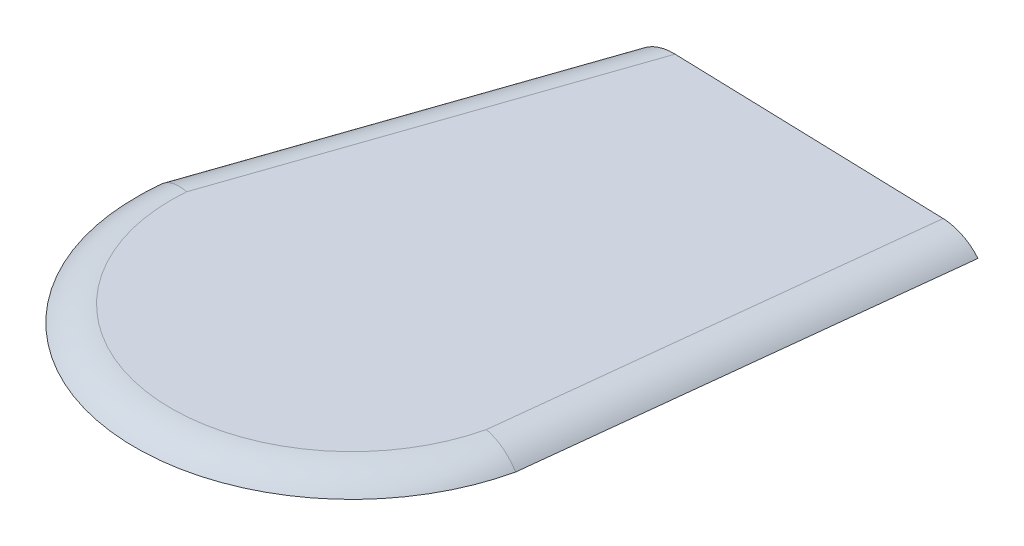
ISO-10303-21;
HEADER;
FILE_DESCRIPTION(('STEP AP214'),'2;1');
FILE_NAME('part.step','',(''),(''),'','','');
FILE_SCHEMA(('AUTOMOTIVE_DESIGN { 1 0 10303 214 1 1 1 1 }'));
ENDSEC;
DATA;
#1=APPLICATION_CONTEXT('core data for automotive mechanical design processes');
#2=APPLICATION_PROTOCOL_DEFINITION('international standard','automotive_design',2000,#1);
#3=PRODUCT_CONTEXT('',#1,'mechanical');
#4=PRODUCT('Part','Part','',(#3));
#5=PRODUCT_RELATED_PRODUCT_CATEGORY('part','',(#4));
#6=PRODUCT_DEFINITION_FORMATION('','',#4);
#7=PRODUCT_DEFINITION_CONTEXT('part definition',#1,'design');
#8=PRODUCT_DEFINITION('design','',#6,#7);
#9=PRODUCT_DEFINITION_SHAPE('','',#8);
#10=(LENGTH_UNIT() NAMED_UNIT(*) SI_UNIT(.MILLI.,.METRE.));
#11=(NAMED_UNIT(*) PLANE_ANGLE_UNIT() SI_UNIT($,.RADIAN.));
#12=(NAMED_UNIT(*) SI_UNIT($,.STERADIAN.) SOLID_ANGLE_UNIT());
#13=UNCERTAINTY_MEASURE_WITH_UNIT(LENGTH_MEASURE(1.E-05),#10,'distance_accuracy_value','');
#14=(GEOMETRIC_REPRESENTATION_CONTEXT(3) GLOBAL_UNCERTAINTY_ASSIGNED_CONTEXT((#13)) GLOBAL_UNIT_ASSIGNED_CONTEXT((#10,
#11,#12)) REPRESENTATION_CONTEXT('',''));
#15=CARTESIAN_POINT('',(0.,0.,0.));
#16=DIRECTION('',(0.,0.,1.));
#17=DIRECTION('',(1.,0.,0.));
#18=AXIS2_PLACEMENT_3D('',#15,#16,#17);
#19=CARTESIAN_POINT('',(0.678586748370826,2.,-22.5418211841631));
#20=DIRECTION('',(-0.0300898262763388,0.,0.999547198662805));
#21=DIRECTION('',(0.999547198662805,0.,0.0300898262763388));
#22=AXIS2_PLACEMENT_3D('',#19,#20,#21);
#23=PLANE('',#22);
#24=DIRECTION('',(-0.999547198662804,0.,-0.0300898262763388));
#25=VECTOR('',#24,1.);
#26=CARTESIAN_POINT('',(0.678586748370826,0.,-22.5418211841631));
#27=LINE('',#26,#25);
#28=CARTESIAN_POINT('',(0.596700744684334,0.,-22.5442862359672));
#29=VERTEX_POINT('',#28);
#30=CARTESIAN_POINT('',(-43.0392322406621,0.,-23.8578786753153));
#31=VERTEX_POINT('',#30);
#32=EDGE_CURVE('E174',#29,#31,#27,.T.);
#33=ORIENTED_EDGE('',*,*,#32,.T.);
#34=CARTESIAN_POINT('',(-38.358233527022,-4.,-23.7169644310639));
#35=DIRECTION('',(-0.0300898262763388,0.,0.999547198662805));
#36=DIRECTION('',(-0.999547198662805,0.,-0.0300898262763388));
#37=AXIS2_PLACEMENT_3D('',#34,#35,#36);
#38=ELLIPSE('',#37,6.28306377545211,6.);
#39=CARTESIAN_POINT('',(-38.358233527022,2.,-23.7169644310639));
#40=VERTEX_POINT('',#39);
#41=EDGE_CURVE('E11',#31,#40,#38,.F.);
#42=ORIENTED_EDGE('',*,*,#41,.T.);
#43=DIRECTION('',(-0.999547198662804,0.,-0.0300898262763388));
#44=VECTOR('',#43,1.);
#45=CARTESIAN_POINT('',(0.678586748370826,2.,-22.5418211841631));
#46=LINE('',#45,#44);
#47=CARTESIAN_POINT('',(-3.88788767722167,2.,-22.6792878514152));
#48=VERTEX_POINT('',#47);
#49=EDGE_CURVE('E179',#48,#40,#46,.T.);
#50=ORIENTED_EDGE('',*,*,#49,.F.);
#51=CARTESIAN_POINT('',(-3.88788767722167,-4.,-22.6792878514152));
#52=DIRECTION('',(-0.0300898262763388,0.,0.999547198662805));
#53=DIRECTION('',(0.999547198662805,0.,0.0300898262763388));
#54=AXIS2_PLACEMENT_3D('',#51,#52,#53);
#55=ELLIPSE('',#54,6.019432344509,6.);
#56=EDGE_CURVE('E58',#48,#29,#55,.F.);
#57=ORIENTED_EDGE('',*,*,#56,.T.);
#58=EDGE_LOOP('',(#33,#42,#50,#57));
#59=FACE_BOUND('',#58,.T.);
#60=ADVANCED_FACE('F43',(#59),#23,.F.);
#61=CARTESIAN_POINT('',(0.,2.,0.));
#62=DIRECTION('',(0.,1.,0.));
#63=DIRECTION('',(0.,0.,1.));
#64=AXIS2_PLACEMENT_3D('',#61,#62,#63);
#65=PLANE('',#64);
#66=ORIENTED_EDGE('',*,*,#49,.T.);
#67=DIRECTION('',(0.325372602289593,0.,-0.94558588699245));
#68=VECTOR('',#67,1.);
#69=CARTESIAN_POINT('',(-54.132878753089,2.,22.1267292085307));
#70=LINE('',#69,#68);
#71=CARTESIAN_POINT('',(-53.9584100348581,2.,21.6196946379498));
#72=VERTEX_POINT('',#71);
#73=EDGE_CURVE('E191',#40,#72,#70,.F.);
#74=ORIENTED_EDGE('',*,*,#73,.T.);
#75=CARTESIAN_POINT('',(-31.5051040541653,2.,23.4510080921156));
#76=DIRECTION('',(0.,1.,0.));
#77=DIRECTION('',(0.,0.,1.));
#78=AXIS2_PLACEMENT_3D('',#75,#76,#77);
#79=CIRCLE('',#78,22.5278640450004);
#80=CARTESIAN_POINT('',(-9.5777856693984,2.,28.6179575676849));
#81=VERTEX_POINT('',#80);
#82=EDGE_CURVE('E73',#72,#81,#79,.T.);
#83=ORIENTED_EDGE('',*,*,#82,.T.);
#84=DIRECTION('',(-0.110244038447534,0.,0.993904548730299));
#85=VECTOR('',#84,1.);
#86=CARTESIAN_POINT('',(-3.84817552353003,2.,-23.0373125641328));
#87=LINE('',#86,#85);
#88=EDGE_CURVE('E183',#81,#48,#87,.F.);
#89=ORIENTED_EDGE('',*,*,#88,.T.);
#90=EDGE_LOOP('',(#66,#74,#83,#89));
#91=FACE_BOUND('',#90,.T.);
#92=ADVANCED_FACE('F128',(#91),#65,.T.);
#93=CARTESIAN_POINT('',(0.,0.,0.));
#94=DIRECTION('',(0.,1.,0.));
#95=DIRECTION('',(0.,0.,1.));
#96=AXIS2_PLACEMENT_3D('',#93,#94,#95);
#97=PLANE('',#96);
#98=DIRECTION('',(-0.325372602289593,0.,0.94558588699245));
#99=VECTOR('',#98,1.);
#100=CARTESIAN_POINT('',(-45.823083255151,0.,-15.7675532690985));
#101=LINE('',#100,#99);
#102=CARTESIAN_POINT('',(-58.3616673968481,0.,20.6716186950597));
#103=VERTEX_POINT('',#102);
#104=EDGE_CURVE('E96',#31,#103,#101,.T.);
#105=ORIENTED_EDGE('',*,*,#104,.F.);
#106=ORIENTED_EDGE('',*,*,#32,.F.);
#107=DIRECTION('',(0.110244038447534,0.,-0.993904548730299));
#108=VECTOR('',#107,1.);
#109=CARTESIAN_POINT('',(-1.8807750934009,0.,-0.208615849452478));
#110=LINE('',#109,#108);
#111=CARTESIAN_POINT('',(-5.16140644687927,0.,29.3678988614193));
#112=VERTEX_POINT('',#111);
#113=EDGE_CURVE('E99',#112,#29,#110,.T.);
#114=ORIENTED_EDGE('',*,*,#113,.F.);
#115=CARTESIAN_POINT('',(-31.5051040541653,0.,23.4510080921156));
#116=DIRECTION('',(0.,1.,0.));
#117=DIRECTION('',(0.,0.,1.));
#118=AXIS2_PLACEMENT_3D('',#115,#116,#117);
#119=CIRCLE('',#118,27.);
#120=EDGE_CURVE('E93',#103,#112,#119,.T.);
#121=ORIENTED_EDGE('',*,*,#120,.F.);
#122=EDGE_LOOP('',(#105,#106,#114,#121));
#123=FACE_BOUND('',#122,.T.);
#124=ADVANCED_FACE('F94',(#123),#97,.F.);
#125=CARTESIAN_POINT('',(-6.32565136161531,-4.,-0.701642177618049));
#126=DIRECTION('',(0.110244038447534,0.,-0.993904548730299));
#127=DIRECTION('',(-0.993904548730299,0.,-0.110244038447534));
#128=AXIS2_PLACEMENT_3D('',#125,#126,#127);
#129=CYLINDRICAL_SURFACE('',#128,6.);
#130=ORIENTED_EDGE('',*,*,#56,.F.);
#131=ORIENTED_EDGE('',*,*,#88,.F.);
#132=CARTESIAN_POINT('',(-5.16140644687927,0.,29.3678988614193));
#133=CARTESIAN_POINT('',(-5.27254849222462,0.125821350856116,29.3493118698725));
#134=CARTESIAN_POINT('',(-5.3889489373634,0.246859594619803,29.3298257581439));
#135=CARTESIAN_POINT('',(-5.63137574178489,0.478568217821492,29.2891922055357));
#136=CARTESIAN_POINT('',(-5.75740186430213,0.589238852125467,29.2680448055191));
#137=CARTESIAN_POINT('',(-6.01827827875744,0.799484237403579,29.2242106151081));
#138=CARTESIAN_POINT('',(-6.15313417543616,0.899051830145948,29.2015228466134));
#139=CARTESIAN_POINT('',(-6.43062287639999,1.08630570015309,29.154771286759));
#140=CARTESIAN_POINT('',(-6.5732553579888,1.17399246989775,29.1307075524942));
#141=CARTESIAN_POINT('',(-6.86536605543831,1.33691546431763,29.0813485975427));
#142=CARTESIAN_POINT('',(-7.01484806591512,1.41214467842591,29.0560526937369));
#143=CARTESIAN_POINT('',(-7.31951582255726,1.5495627874687,29.0044104628682));
#144=CARTESIAN_POINT('',(-7.47470156276801,1.61175169601656,28.9780641369018));
#145=CARTESIAN_POINT('',(-7.78941613294995,1.72256301281589,28.9245408602065));
#146=CARTESIAN_POINT('',(-7.94893761477725,1.77120697358051,28.8973653062876));
#147=CARTESIAN_POINT('',(-8.27136940195525,1.85470348927556,28.8423363911374));
#148=CARTESIAN_POINT('',(-8.43427829766716,1.88956166473805,28.8144833110635));
#149=CARTESIAN_POINT('',(-8.75294371191275,1.94367087923053,28.7598961476661));
#150=CARTESIAN_POINT('',(-8.90857335672582,1.96370359561267,28.7331897245181));
#151=CARTESIAN_POINT('',(-9.220755747113,1.99119025993735,28.6795188891701));
#152=CARTESIAN_POINT('',(-9.37730731022883,1.99865780921786,28.6525547877469));
#153=CARTESIAN_POINT('',(-9.54848603781238,1.99994500553513,28.6230150594652));
#154=CARTESIAN_POINT('',(-9.56313618808508,2.00000006470662,28.6204864822192));
#155=CARTESIAN_POINT('',(-9.57778566939846,2.,28.6179575676846));
#156=B_SPLINE_CURVE_WITH_KNOTS('',3,(#132,#133,#134,#135,#136,#137,#138,#139,#140,#141,#142,
#143,#144,#145,#146,#147,#148,#149,#150,#151,#152,#153,#154,#155),.UNSPECIFIED.,.F.,.F.,(4,2,2,
2,2,2,2,2,2,2,2,4),(0.,0.506560490439386,1.01310852488007,1.51998127004747,2.02683299806374,
2.53396899777419,3.04110446805993,3.54742831990363,4.05354552769967,4.53058207645517,
5.00710191745637,5.05170203621905),.UNSPECIFIED.);
#157=EDGE_CURVE('E48',#112,#81,#156,.T.);
#158=ORIENTED_EDGE('',*,*,#157,.F.);
#159=ORIENTED_EDGE('',*,*,#113,.T.);
#160=EDGE_LOOP('',(#130,#131,#158,#159));
#161=FACE_BOUND('',#160,.T.);
#162=ADVANCED_FACE('F45',(#161),#129,.T.);
#163=CARTESIAN_POINT('',(-31.5051040541653,-4.,23.4510080921156));
#164=DIRECTION('',(0.,-1.,0.));
#165=DIRECTION('',(0.,0.,-1.));
#166=AXIS2_PLACEMENT_3D('',#163,#164,#165);
#167=TOROIDAL_SURFACE('',#166,22.5278640450004,6.);
#168=ORIENTED_EDGE('',*,*,#157,.T.);
#169=ORIENTED_EDGE('',*,*,#82,.F.);
#170=CARTESIAN_POINT('',(-58.3616673968481,0.,20.6716186950597));
#171=CARTESIAN_POINT('',(-58.2507356018277,0.12621254870748,20.6961067501829));
#172=CARTESIAN_POINT('',(-58.1345495660291,0.247582305699947,20.721712875573));
#173=CARTESIAN_POINT('',(-57.8925702384126,0.479839858022737,20.7749368499313));
#174=CARTESIAN_POINT('',(-57.7667774369181,0.590728187673041,20.8025545962244));
#175=CARTESIAN_POINT('',(-57.5064174805353,0.801285497874632,20.8595923875947));
#176=CARTESIAN_POINT('',(-57.3718465187504,0.900949558930384,20.8890132142897));
#177=CARTESIAN_POINT('',(-57.0949553471938,1.08831362372245,20.9494061491706));
#178=CARTESIAN_POINT('',(-56.9526354027509,1.17601403673966,20.9803782042388));
#179=CARTESIAN_POINT('',(-56.6611969855714,1.33888606617176,21.043640344958));
#180=CARTESIAN_POINT('',(-56.5120756693717,1.41405238013887,21.0759309812693));
#181=CARTESIAN_POINT('',(-56.20815087259,1.55130017138521,21.1415630895437));
#182=CARTESIAN_POINT('',(-56.0533473775124,1.61338161528128,21.1749045641876));
#183=CARTESIAN_POINT('',(-55.7393944012788,1.72395721831621,21.2423271586732));
#184=CARTESIAN_POINT('',(-55.5802518579905,1.77247181522019,21.2764070817073));
#185=CARTESIAN_POINT('',(-55.2585731154859,1.85570010000846,21.3450822729626));
#186=CARTESIAN_POINT('',(-55.0960382992155,1.89041930057507,21.3796773295897));
#187=CARTESIAN_POINT('',(-54.7764613377608,1.94453816620295,21.4474789240156));
#188=CARTESIAN_POINT('',(-54.6195258285271,1.96458816168803,21.4806732051477));
#189=CARTESIAN_POINT('',(-54.3046869631591,1.99185983137068,21.5470528202109));
#190=CARTESIAN_POINT('',(-54.1467848667181,1.9990956427687,21.5802381235663));
#191=CARTESIAN_POINT('',(-53.9787320797009,1.99997350276047,21.615439258656));
#192=CARTESIAN_POINT('',(-53.9685709582843,2.00000002983285,21.6175671982665));
#193=CARTESIAN_POINT('',(-53.958410034858,2.,21.6196946379494));
#194=B_SPLINE_CURVE_WITH_KNOTS('',3,(#170,#171,#172,#173,#174,#175,#176,#177,#178,#179,#180,
#181,#182,#183,#184,#185,#186,#187,#188,#189,#190,#191,#192,#193),.UNSPECIFIED.,.F.,.F.,(4,2,2,
2,2,2,2,2,2,2,2,4),(0.,0.509266945554478,1.01850791578925,1.52797122019207,2.03741709129079,
2.54707793551363,3.05674008000813,3.56563025677439,4.0743168744729,4.55879907333364,
5.04274643526392,5.07389101930428),.UNSPECIFIED.);
#195=EDGE_CURVE('E66',#103,#72,#194,.T.);
#196=ORIENTED_EDGE('',*,*,#195,.F.);
#197=ORIENTED_EDGE('',*,*,#120,.T.);
#198=EDGE_LOOP('',(#168,#169,#196,#197));
#199=FACE_BOUND('',#198,.T.);
#200=ADVANCED_FACE('F108',(#199),#167,.T.);
#201=CARTESIAN_POINT('',(-41.5942946113919,-4.,-14.3124427556274));
#202=DIRECTION('',(-0.325372602289593,0.,0.94558588699245));
#203=DIRECTION('',(0.94558588699245,0.,0.325372602289593));
#204=AXIS2_PLACEMENT_3D('',#201,#202,#203);
#205=CYLINDRICAL_SURFACE('',#204,6.);
#206=ORIENTED_EDGE('',*,*,#41,.F.);
#207=ORIENTED_EDGE('',*,*,#104,.T.);
#208=ORIENTED_EDGE('',*,*,#195,.T.);
#209=ORIENTED_EDGE('',*,*,#73,.F.);
#210=EDGE_LOOP('',(#206,#207,#208,#209));
#211=FACE_BOUND('',#210,.T.);
#212=ADVANCED_FACE('F105',(#211),#205,.T.);
#213=CLOSED_SHELL('',(#60,#92,#124,#162,#200,#212));
#214=MANIFOLD_SOLID_BREP('B2',#213);
#215=ADVANCED_BREP_SHAPE_REPRESENTATION('',(#18,#214),#14);
#216=SHAPE_DEFINITION_REPRESENTATION(#9,#215);
ENDSEC;
END-ISO-10303-21;
